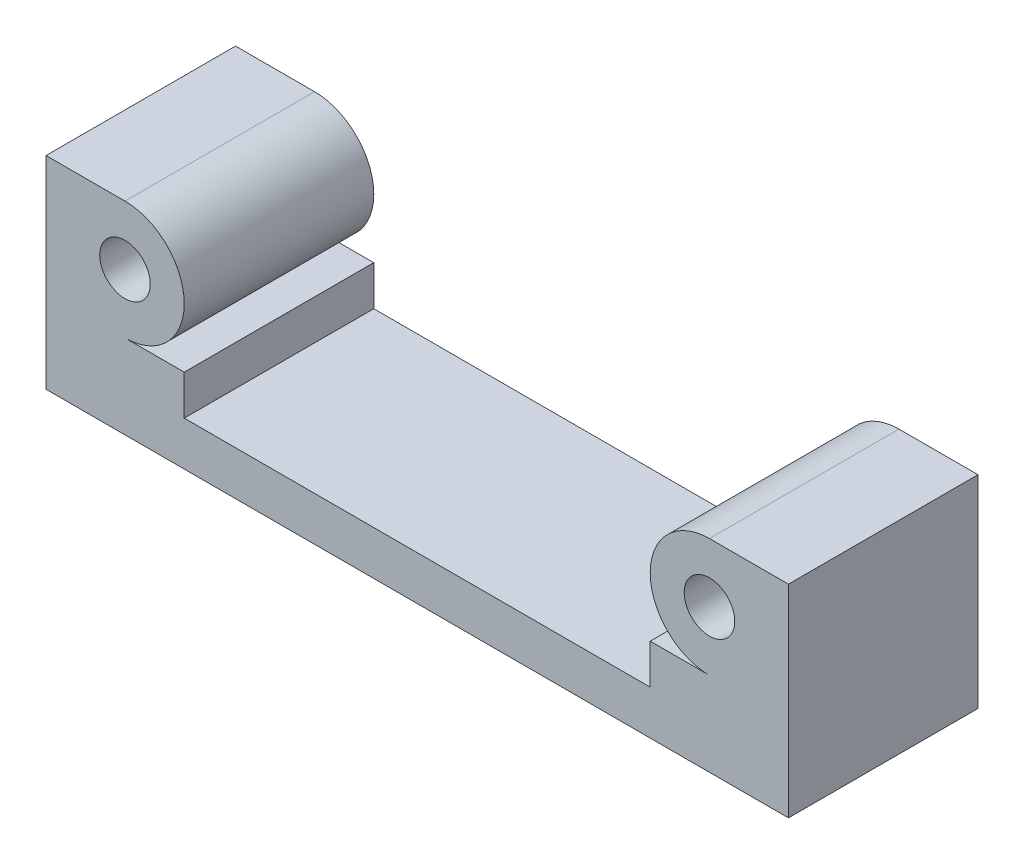
ISO-10303-21;
HEADER;
FILE_DESCRIPTION(('STEP AP214'),'2;1');
FILE_NAME('part.step','',(''),(''),'','','');
FILE_SCHEMA(('AUTOMOTIVE_DESIGN { 1 0 10303 214 1 1 1 1 }'));
ENDSEC;
DATA;
#1=APPLICATION_CONTEXT('core data for automotive mechanical design processes');
#2=APPLICATION_PROTOCOL_DEFINITION('international standard','automotive_design',2000,#1);
#3=PRODUCT_CONTEXT('',#1,'mechanical');
#4=PRODUCT('Part','Part','',(#3));
#5=PRODUCT_RELATED_PRODUCT_CATEGORY('part','',(#4));
#6=PRODUCT_DEFINITION_FORMATION('','',#4);
#7=PRODUCT_DEFINITION_CONTEXT('part definition',#1,'design');
#8=PRODUCT_DEFINITION('design','',#6,#7);
#9=PRODUCT_DEFINITION_SHAPE('','',#8);
#10=(LENGTH_UNIT() NAMED_UNIT(*) SI_UNIT(.MILLI.,.METRE.));
#11=(NAMED_UNIT(*) PLANE_ANGLE_UNIT() SI_UNIT($,.RADIAN.));
#12=(NAMED_UNIT(*) SI_UNIT($,.STERADIAN.) SOLID_ANGLE_UNIT());
#13=UNCERTAINTY_MEASURE_WITH_UNIT(LENGTH_MEASURE(1.E-05),#10,'distance_accuracy_value','');
#14=(GEOMETRIC_REPRESENTATION_CONTEXT(3) GLOBAL_UNCERTAINTY_ASSIGNED_CONTEXT((#13)) GLOBAL_UNIT_ASSIGNED_CONTEXT((#10,
#11,#12)) REPRESENTATION_CONTEXT('',''));
#15=CARTESIAN_POINT('',(0.,0.,0.));
#16=DIRECTION('',(0.,0.,1.));
#17=DIRECTION('',(1.,0.,0.));
#18=AXIS2_PLACEMENT_3D('',#15,#16,#17);
#19=CARTESIAN_POINT('',(0.,2.52312353150435,60.7158822655204));
#20=DIRECTION('',(0.,1.,0.));
#21=DIRECTION('',(0.,0.,1.));
#22=AXIS2_PLACEMENT_3D('',#19,#20,#21);
#23=PLANE('',#22);
#24=DIRECTION('',(0.,0.,-1.));
#25=VECTOR('',#24,1.);
#26=CARTESIAN_POINT('',(-3.75,2.52312353150435,60.7158822655204));
#27=LINE('',#26,#25);
#28=CARTESIAN_POINT('',(-3.75,2.52312353150435,12.));
#29=VERTEX_POINT('',#28);
#30=CARTESIAN_POINT('',(-3.75,2.52312353150435,0.));
#31=VERTEX_POINT('',#30);
#32=EDGE_CURVE('E165',#29,#31,#27,.T.);
#33=ORIENTED_EDGE('',*,*,#32,.F.);
#34=DIRECTION('',(1.,0.,0.));
#35=VECTOR('',#34,1.);
#36=CARTESIAN_POINT('',(0.,2.52312353150435,12.));
#37=LINE('',#36,#35);
#38=CARTESIAN_POINT('',(0.,2.52312353150435,12.));
#39=VERTEX_POINT('',#38);
#40=EDGE_CURVE('E136',#29,#39,#37,.T.);
#41=ORIENTED_EDGE('',*,*,#40,.T.);
#42=DIRECTION('',(0.,0.,-1.));
#43=VECTOR('',#42,1.);
#44=CARTESIAN_POINT('',(0.,2.52312353150435,60.7158822655204));
#45=LINE('',#44,#43);
#46=CARTESIAN_POINT('',(0.,2.52312353150435,0.));
#47=VERTEX_POINT('',#46);
#48=EDGE_CURVE('E162',#39,#47,#45,.T.);
#49=ORIENTED_EDGE('',*,*,#48,.T.);
#50=DIRECTION('',(1.,0.,0.));
#51=VECTOR('',#50,1.);
#52=CARTESIAN_POINT('',(0.,2.52312353150435,0.));
#53=LINE('',#52,#51);
#54=EDGE_CURVE('E170',#31,#47,#53,.T.);
#55=ORIENTED_EDGE('',*,*,#54,.F.);
#56=EDGE_LOOP('',(#33,#41,#49,#55));
#57=FACE_BOUND('',#56,.T.);
#58=ADVANCED_FACE('F37',(#57),#23,.T.);
#59=CARTESIAN_POINT('',(0.,0.,60.7158822655204));
#60=DIRECTION('',(1.,0.,0.));
#61=DIRECTION('',(0.,0.,-1.));
#62=AXIS2_PLACEMENT_3D('',#59,#60,#61);
#63=PLANE('',#62);
#64=ORIENTED_EDGE('',*,*,#48,.F.);
#65=DIRECTION('',(0.,-1.,0.));
#66=VECTOR('',#65,1.);
#67=CARTESIAN_POINT('',(0.,0.,12.));
#68=LINE('',#67,#66);
#69=CARTESIAN_POINT('',(0.,0.,12.));
#70=VERTEX_POINT('',#69);
#71=EDGE_CURVE('E131',#39,#70,#68,.T.);
#72=ORIENTED_EDGE('',*,*,#71,.T.);
#73=DIRECTION('',(0.,0.,-1.));
#74=VECTOR('',#73,1.);
#75=CARTESIAN_POINT('',(0.,0.,60.7158822655204));
#76=LINE('',#75,#74);
#77=CARTESIAN_POINT('',(0.,0.,0.));
#78=VERTEX_POINT('',#77);
#79=EDGE_CURVE('E159',#70,#78,#76,.T.);
#80=ORIENTED_EDGE('',*,*,#79,.T.);
#81=DIRECTION('',(0.,-1.,0.));
#82=VECTOR('',#81,1.);
#83=CARTESIAN_POINT('',(0.,0.,0.));
#84=LINE('',#83,#82);
#85=EDGE_CURVE('E173',#47,#78,#84,.T.);
#86=ORIENTED_EDGE('',*,*,#85,.F.);
#87=EDGE_LOOP('',(#64,#72,#80,#86));
#88=FACE_BOUND('',#87,.T.);
#89=ADVANCED_FACE('F221',(#88),#63,.T.);
#90=CARTESIAN_POINT('',(0.,0.,60.7158822655204));
#91=DIRECTION('',(0.,1.,0.));
#92=DIRECTION('',(0.,0.,1.));
#93=AXIS2_PLACEMENT_3D('',#90,#91,#92);
#94=PLANE('',#93);
#95=ORIENTED_EDGE('',*,*,#79,.F.);
#96=DIRECTION('',(1.,0.,0.));
#97=VECTOR('',#96,1.);
#98=CARTESIAN_POINT('',(0.,0.,12.));
#99=LINE('',#98,#97);
#100=CARTESIAN_POINT('',(29.5,0.,12.));
#101=VERTEX_POINT('',#100);
#102=EDGE_CURVE('E68',#70,#101,#99,.T.);
#103=ORIENTED_EDGE('',*,*,#102,.T.);
#104=DIRECTION('',(0.,0.,-1.));
#105=VECTOR('',#104,1.);
#106=CARTESIAN_POINT('',(29.5,0.,60.7158822655204));
#107=LINE('',#106,#105);
#108=CARTESIAN_POINT('',(29.5,0.,0.));
#109=VERTEX_POINT('',#108);
#110=EDGE_CURVE('E127',#101,#109,#107,.T.);
#111=ORIENTED_EDGE('',*,*,#110,.T.);
#112=DIRECTION('',(1.,0.,0.));
#113=VECTOR('',#112,1.);
#114=CARTESIAN_POINT('',(0.,0.,0.));
#115=LINE('',#114,#113);
#116=EDGE_CURVE('E176',#78,#109,#115,.T.);
#117=ORIENTED_EDGE('',*,*,#116,.F.);
#118=EDGE_LOOP('',(#95,#103,#111,#117));
#119=FACE_BOUND('',#118,.T.);
#120=ADVANCED_FACE('F266',(#119),#94,.T.);
#121=CARTESIAN_POINT('',(29.5,0.,60.7158822655204));
#122=DIRECTION('',(-1.,0.,0.));
#123=DIRECTION('',(0.,0.,1.));
#124=AXIS2_PLACEMENT_3D('',#121,#122,#123);
#125=PLANE('',#124);
#126=ORIENTED_EDGE('',*,*,#110,.F.);
#127=DIRECTION('',(0.,1.,0.));
#128=VECTOR('',#127,1.);
#129=CARTESIAN_POINT('',(29.5,0.,12.));
#130=LINE('',#129,#128);
#131=CARTESIAN_POINT('',(29.5,2.52312353150435,12.));
#132=VERTEX_POINT('',#131);
#133=EDGE_CURVE('E109',#101,#132,#130,.T.);
#134=ORIENTED_EDGE('',*,*,#133,.T.);
#135=DIRECTION('',(0.,0.,-1.));
#136=VECTOR('',#135,1.);
#137=CARTESIAN_POINT('',(29.5,2.52312353150435,60.7158822655204));
#138=LINE('',#137,#136);
#139=CARTESIAN_POINT('',(29.5,2.52312353150435,0.));
#140=VERTEX_POINT('',#139);
#141=EDGE_CURVE('E118',#132,#140,#138,.T.);
#142=ORIENTED_EDGE('',*,*,#141,.T.);
#143=DIRECTION('',(0.,1.,0.));
#144=VECTOR('',#143,1.);
#145=CARTESIAN_POINT('',(29.5,0.,0.));
#146=LINE('',#145,#144);
#147=EDGE_CURVE('E179',#109,#140,#146,.T.);
#148=ORIENTED_EDGE('',*,*,#147,.F.);
#149=EDGE_LOOP('',(#126,#134,#142,#148));
#150=FACE_BOUND('',#149,.T.);
#151=ADVANCED_FACE('F129',(#150),#125,.T.);
#152=CARTESIAN_POINT('',(0.,2.52312353150426,60.7158822655204));
#153=DIRECTION('',(0.,1.,0.));
#154=DIRECTION('',(-1.,0.,0.));
#155=AXIS2_PLACEMENT_3D('',#152,#153,#154);
#156=PLANE('',#155);
#157=ORIENTED_EDGE('',*,*,#141,.F.);
#158=DIRECTION('',(1.,0.,0.));
#159=VECTOR('',#158,1.);
#160=CARTESIAN_POINT('',(0.,2.52312353150426,12.));
#161=LINE('',#160,#159);
#162=CARTESIAN_POINT('',(33.25,2.52312353150437,12.));
#163=VERTEX_POINT('',#162);
#164=EDGE_CURVE('E105',#132,#163,#161,.T.);
#165=ORIENTED_EDGE('',*,*,#164,.T.);
#166=DIRECTION('',(0.,0.,-1.));
#167=VECTOR('',#166,1.);
#168=CARTESIAN_POINT('',(33.25,2.52312353150437,60.7158822655204));
#169=LINE('',#168,#167);
#170=CARTESIAN_POINT('',(33.25,2.52312353150437,0.));
#171=VERTEX_POINT('',#170);
#172=EDGE_CURVE('E126',#163,#171,#169,.T.);
#173=ORIENTED_EDGE('',*,*,#172,.T.);
#174=DIRECTION('',(1.,0.,0.));
#175=VECTOR('',#174,1.);
#176=CARTESIAN_POINT('',(0.,2.52312353150426,0.));
#177=LINE('',#176,#175);
#178=EDGE_CURVE('E122',#140,#171,#177,.T.);
#179=ORIENTED_EDGE('',*,*,#178,.F.);
#180=EDGE_LOOP('',(#157,#165,#173,#179));
#181=FACE_BOUND('',#180,.T.);
#182=ADVANCED_FACE('F119',(#181),#156,.T.);
#183=CARTESIAN_POINT('',(33.25,6.27312353150437,60.7158822655204));
#184=DIRECTION('',(0.,0.,-1.));
#185=DIRECTION('',(-1.,0.,0.));
#186=AXIS2_PLACEMENT_3D('',#183,#184,#185);
#187=CYLINDRICAL_SURFACE('',#186,3.75);
#188=CARTESIAN_POINT('',(33.25,6.27312353150437,12.));
#189=DIRECTION('',(0.,0.,1.));
#190=DIRECTION('',(1.,0.,0.));
#191=AXIS2_PLACEMENT_3D('',#188,#189,#190);
#192=CIRCLE('',#191,3.75);
#193=CARTESIAN_POINT('',(33.25,10.0231235315044,12.));
#194=VERTEX_POINT('',#193);
#195=EDGE_CURVE('E111',#194,#163,#192,.T.);
#196=ORIENTED_EDGE('',*,*,#195,.F.);
#197=DIRECTION('',(0.,0.,-1.));
#198=VECTOR('',#197,1.);
#199=CARTESIAN_POINT('',(33.25,10.0231235315044,60.7158822655204));
#200=LINE('',#199,#198);
#201=CARTESIAN_POINT('',(33.25,10.0231235315044,0.));
#202=VERTEX_POINT('',#201);
#203=EDGE_CURVE('E154',#194,#202,#200,.T.);
#204=ORIENTED_EDGE('',*,*,#203,.T.);
#205=CARTESIAN_POINT('',(33.25,6.27312353150437,0.));
#206=DIRECTION('',(0.,0.,1.));
#207=DIRECTION('',(1.,0.,0.));
#208=AXIS2_PLACEMENT_3D('',#205,#206,#207);
#209=CIRCLE('',#208,3.75);
#210=EDGE_CURVE('E182',#202,#171,#209,.T.);
#211=ORIENTED_EDGE('',*,*,#210,.T.);
#212=ORIENTED_EDGE('',*,*,#172,.F.);
#213=EDGE_LOOP('',(#196,#204,#211,#212));
#214=FACE_BOUND('',#213,.T.);
#215=ADVANCED_FACE('F279',(#214),#187,.T.);
#216=CARTESIAN_POINT('',(0.,10.0231235315044,60.7158822655204));
#217=DIRECTION('',(0.,-1.,0.));
#218=DIRECTION('',(1.,0.,0.));
#219=AXIS2_PLACEMENT_3D('',#216,#217,#218);
#220=PLANE('',#219);
#221=DIRECTION('',(-1.,0.,0.));
#222=VECTOR('',#221,1.);
#223=CARTESIAN_POINT('',(0.,10.0231235315044,12.));
#224=LINE('',#223,#222);
#225=CARTESIAN_POINT('',(38.25,10.0231235315044,12.));
#226=VERTEX_POINT('',#225);
#227=EDGE_CURVE('E207',#226,#194,#224,.T.);
#228=ORIENTED_EDGE('',*,*,#227,.F.);
#229=DIRECTION('',(0.,0.,-1.));
#230=VECTOR('',#229,1.);
#231=CARTESIAN_POINT('',(38.25,10.0231235315044,60.7158822655204));
#232=LINE('',#231,#230);
#233=CARTESIAN_POINT('',(38.25,10.0231235315044,0.));
#234=VERTEX_POINT('',#233);
#235=EDGE_CURVE('E151',#226,#234,#232,.T.);
#236=ORIENTED_EDGE('',*,*,#235,.T.);
#237=DIRECTION('',(-1.,0.,0.));
#238=VECTOR('',#237,1.);
#239=CARTESIAN_POINT('',(0.,10.0231235315044,0.));
#240=LINE('',#239,#238);
#241=EDGE_CURVE('E185',#234,#202,#240,.T.);
#242=ORIENTED_EDGE('',*,*,#241,.T.);
#243=ORIENTED_EDGE('',*,*,#203,.F.);
#244=EDGE_LOOP('',(#228,#236,#242,#243));
#245=FACE_BOUND('',#244,.T.);
#246=ADVANCED_FACE('F282',(#245),#220,.F.);
#247=CARTESIAN_POINT('',(38.25,0.,60.7158822655204));
#248=DIRECTION('',(-1.,0.,0.));
#249=DIRECTION('',(0.,-1.,0.));
#250=AXIS2_PLACEMENT_3D('',#247,#248,#249);
#251=PLANE('',#250);
#252=DIRECTION('',(0.,1.,0.));
#253=VECTOR('',#252,1.);
#254=CARTESIAN_POINT('',(38.25,0.,12.));
#255=LINE('',#254,#253);
#256=CARTESIAN_POINT('',(38.25,-2.79238211236493,12.));
#257=VERTEX_POINT('',#256);
#258=EDGE_CURVE('E56',#257,#226,#255,.T.);
#259=ORIENTED_EDGE('',*,*,#258,.F.);
#260=DIRECTION('',(0.,0.,-1.));
#261=VECTOR('',#260,1.);
#262=CARTESIAN_POINT('',(38.25,-2.79238211236493,60.7158822655204));
#263=LINE('',#262,#261);
#264=CARTESIAN_POINT('',(38.25,-2.79238211236493,0.));
#265=VERTEX_POINT('',#264);
#266=EDGE_CURVE('E148',#257,#265,#263,.T.);
#267=ORIENTED_EDGE('',*,*,#266,.T.);
#268=DIRECTION('',(0.,1.,0.));
#269=VECTOR('',#268,1.);
#270=CARTESIAN_POINT('',(38.25,0.,0.));
#271=LINE('',#270,#269);
#272=EDGE_CURVE('E188',#265,#234,#271,.T.);
#273=ORIENTED_EDGE('',*,*,#272,.T.);
#274=ORIENTED_EDGE('',*,*,#235,.F.);
#275=EDGE_LOOP('',(#259,#267,#273,#274));
#276=FACE_BOUND('',#275,.T.);
#277=ADVANCED_FACE('F286',(#276),#251,.F.);
#278=CARTESIAN_POINT('',(0.,-2.79238211236493,60.7158822655204));
#279=DIRECTION('',(0.,1.,0.));
#280=DIRECTION('',(0.,0.,1.));
#281=AXIS2_PLACEMENT_3D('',#278,#279,#280);
#282=PLANE('',#281);
#283=DIRECTION('',(1.,0.,0.));
#284=VECTOR('',#283,1.);
#285=CARTESIAN_POINT('',(0.,-2.79238211236493,12.));
#286=LINE('',#285,#284);
#287=CARTESIAN_POINT('',(-8.74999999999999,-2.79238211236493,12.));
#288=VERTEX_POINT('',#287);
#289=EDGE_CURVE('E41',#288,#257,#286,.T.);
#290=ORIENTED_EDGE('',*,*,#289,.F.);
#291=DIRECTION('',(0.,0.,-1.));
#292=VECTOR('',#291,1.);
#293=CARTESIAN_POINT('',(-8.75,-2.79238211236493,60.7158822655204));
#294=LINE('',#293,#292);
#295=CARTESIAN_POINT('',(-8.75,-2.79238211236493,0.));
#296=VERTEX_POINT('',#295);
#297=EDGE_CURVE('E145',#288,#296,#294,.T.);
#298=ORIENTED_EDGE('',*,*,#297,.T.);
#299=DIRECTION('',(1.,0.,0.));
#300=VECTOR('',#299,1.);
#301=CARTESIAN_POINT('',(0.,-2.79238211236493,0.));
#302=LINE('',#301,#300);
#303=EDGE_CURVE('E191',#296,#265,#302,.T.);
#304=ORIENTED_EDGE('',*,*,#303,.T.);
#305=ORIENTED_EDGE('',*,*,#266,.F.);
#306=EDGE_LOOP('',(#290,#298,#304,#305));
#307=FACE_BOUND('',#306,.T.);
#308=ADVANCED_FACE('F290',(#307),#282,.F.);
#309=CARTESIAN_POINT('',(-8.75,0.,60.7158822655204));
#310=DIRECTION('',(1.,0.,0.));
#311=DIRECTION('',(0.,1.,0.));
#312=AXIS2_PLACEMENT_3D('',#309,#310,#311);
#313=PLANE('',#312);
#314=DIRECTION('',(0.,-1.,0.));
#315=VECTOR('',#314,1.);
#316=CARTESIAN_POINT('',(-8.75,0.,12.));
#317=LINE('',#316,#315);
#318=CARTESIAN_POINT('',(-8.75,10.0231235315044,12.));
#319=VERTEX_POINT('',#318);
#320=EDGE_CURVE('E92',#319,#288,#317,.T.);
#321=ORIENTED_EDGE('',*,*,#320,.F.);
#322=DIRECTION('',(0.,0.,-1.));
#323=VECTOR('',#322,1.);
#324=CARTESIAN_POINT('',(-8.75,10.0231235315044,60.7158822655204));
#325=LINE('',#324,#323);
#326=CARTESIAN_POINT('',(-8.75,10.0231235315044,0.));
#327=VERTEX_POINT('',#326);
#328=EDGE_CURVE('E142',#319,#327,#325,.T.);
#329=ORIENTED_EDGE('',*,*,#328,.T.);
#330=DIRECTION('',(0.,-1.,0.));
#331=VECTOR('',#330,1.);
#332=CARTESIAN_POINT('',(-8.75,0.,0.));
#333=LINE('',#332,#331);
#334=EDGE_CURVE('E194',#327,#296,#333,.T.);
#335=ORIENTED_EDGE('',*,*,#334,.T.);
#336=ORIENTED_EDGE('',*,*,#297,.F.);
#337=EDGE_LOOP('',(#321,#329,#335,#336));
#338=FACE_BOUND('',#337,.T.);
#339=ADVANCED_FACE('F259',(#338),#313,.F.);
#340=CARTESIAN_POINT('',(0.,10.0231235315044,60.7158822655204));
#341=DIRECTION('',(0.,-1.,0.));
#342=DIRECTION('',(0.,0.,-1.));
#343=AXIS2_PLACEMENT_3D('',#340,#341,#342);
#344=PLANE('',#343);
#345=DIRECTION('',(-1.,0.,0.));
#346=VECTOR('',#345,1.);
#347=CARTESIAN_POINT('',(0.,10.0231235315044,12.));
#348=LINE('',#347,#346);
#349=CARTESIAN_POINT('',(-3.75,10.0231235315044,12.));
#350=VERTEX_POINT('',#349);
#351=EDGE_CURVE('E88',#350,#319,#348,.T.);
#352=ORIENTED_EDGE('',*,*,#351,.F.);
#353=DIRECTION('',(0.,0.,-1.));
#354=VECTOR('',#353,1.);
#355=CARTESIAN_POINT('',(-3.75,10.0231235315044,60.7158822655204));
#356=LINE('',#355,#354);
#357=CARTESIAN_POINT('',(-3.75,10.0231235315044,0.));
#358=VERTEX_POINT('',#357);
#359=EDGE_CURVE('E139',#350,#358,#356,.T.);
#360=ORIENTED_EDGE('',*,*,#359,.T.);
#361=DIRECTION('',(-1.,0.,0.));
#362=VECTOR('',#361,1.);
#363=CARTESIAN_POINT('',(0.,10.0231235315044,0.));
#364=LINE('',#363,#362);
#365=EDGE_CURVE('E197',#358,#327,#364,.T.);
#366=ORIENTED_EDGE('',*,*,#365,.T.);
#367=ORIENTED_EDGE('',*,*,#328,.F.);
#368=EDGE_LOOP('',(#352,#360,#366,#367));
#369=FACE_BOUND('',#368,.T.);
#370=ADVANCED_FACE('F249',(#369),#344,.F.);
#371=CARTESIAN_POINT('',(-3.75,6.27312353150435,60.7158822655204));
#372=DIRECTION('',(0.,0.,-1.));
#373=DIRECTION('',(-1.,0.,0.));
#374=AXIS2_PLACEMENT_3D('',#371,#372,#373);
#375=CYLINDRICAL_SURFACE('',#374,3.75);
#376=CARTESIAN_POINT('',(-3.75,6.27312353150435,12.));
#377=DIRECTION('',(0.,0.,1.));
#378=DIRECTION('',(1.,0.,0.));
#379=AXIS2_PLACEMENT_3D('',#376,#377,#378);
#380=CIRCLE('',#379,3.75);
#381=EDGE_CURVE('E78',#29,#350,#380,.T.);
#382=ORIENTED_EDGE('',*,*,#381,.F.);
#383=ORIENTED_EDGE('',*,*,#32,.T.);
#384=CARTESIAN_POINT('',(-3.75,6.27312353150435,0.));
#385=DIRECTION('',(0.,0.,1.));
#386=DIRECTION('',(1.,0.,0.));
#387=AXIS2_PLACEMENT_3D('',#384,#385,#386);
#388=CIRCLE('',#387,3.75);
#389=EDGE_CURVE('E200',#31,#358,#388,.T.);
#390=ORIENTED_EDGE('',*,*,#389,.T.);
#391=ORIENTED_EDGE('',*,*,#359,.F.);
#392=EDGE_LOOP('',(#382,#383,#390,#391));
#393=FACE_BOUND('',#392,.T.);
#394=ADVANCED_FACE('F252',(#393),#375,.T.);
#395=CARTESIAN_POINT('',(-3.75,6.27312353150435,60.7158822655204));
#396=DIRECTION('',(0.,0.,-1.));
#397=DIRECTION('',(-1.,0.,0.));
#398=AXIS2_PLACEMENT_3D('',#395,#396,#397);
#399=CYLINDRICAL_SURFACE('',#398,1.6);
#400=CARTESIAN_POINT('',(-3.75,6.27312353150435,0.));
#401=DIRECTION('',(0.,0.,1.));
#402=DIRECTION('',(1.,0.,0.));
#403=AXIS2_PLACEMENT_3D('',#400,#401,#402);
#404=CIRCLE('',#403,1.6);
#405=CARTESIAN_POINT('',(-5.35,6.27312353150435,0.));
#406=VERTEX_POINT('',#405);
#407=EDGE_CURVE('E203',#406,#406,#404,.T.);
#408=CARTESIAN_POINT('',(-3.75,6.27312353150435,12.));
#409=DIRECTION('',(0.,0.,1.));
#410=DIRECTION('',(1.,0.,0.));
#411=AXIS2_PLACEMENT_3D('',#408,#409,#410);
#412=CIRCLE('',#411,1.6);
#413=CARTESIAN_POINT('',(-5.35,6.27312353150435,12.));
#414=VERTEX_POINT('',#413);
#415=EDGE_CURVE('E11',#414,#414,#412,.T.);
#416=CARTESIAN_POINT('',(-5.35,6.27312353150435,0.));
#417=CARTESIAN_POINT('',(-5.35,6.27312353150435,0.125));
#418=CARTESIAN_POINT('',(-5.35,6.27312353150435,0.25));
#419=CARTESIAN_POINT('',(-5.35,6.27312353150435,0.5));
#420=CARTESIAN_POINT('',(-5.35,6.27312353150435,0.625000000000001));
#421=CARTESIAN_POINT('',(-5.35,6.27312353150435,0.875000000000001));
#422=CARTESIAN_POINT('',(-5.35,6.27312353150435,1.));
#423=CARTESIAN_POINT('',(-5.35,6.27312353150435,1.25));
#424=CARTESIAN_POINT('',(-5.35,6.27312353150435,1.375));
#425=CARTESIAN_POINT('',(-5.35,6.27312353150435,1.625));
#426=CARTESIAN_POINT('',(-5.35,6.27312353150435,1.75));
#427=CARTESIAN_POINT('',(-5.35,6.27312353150435,1.99999999999999));
#428=CARTESIAN_POINT('',(-5.35,6.27312353150435,2.125));
#429=CARTESIAN_POINT('',(-5.35,6.27312353150435,2.375));
#430=CARTESIAN_POINT('',(-5.35,6.27312353150435,2.5));
#431=CARTESIAN_POINT('',(-5.35,6.27312353150435,2.75));
#432=CARTESIAN_POINT('',(-5.35,6.27312353150435,2.875));
#433=CARTESIAN_POINT('',(-5.35,6.27312353150435,3.125));
#434=CARTESIAN_POINT('',(-5.35,6.27312353150435,3.25));
#435=CARTESIAN_POINT('',(-5.35,6.27312353150435,3.5));
#436=CARTESIAN_POINT('',(-5.35,6.27312353150435,3.625));
#437=CARTESIAN_POINT('',(-5.35,6.27312353150435,3.875));
#438=CARTESIAN_POINT('',(-5.35,6.27312353150435,4.));
#439=CARTESIAN_POINT('',(-5.35,6.27312353150435,4.24999999999999));
#440=CARTESIAN_POINT('',(-5.35,6.27312353150435,4.37499999999999));
#441=CARTESIAN_POINT('',(-5.35,6.27312353150435,4.62499999999999));
#442=CARTESIAN_POINT('',(-5.35,6.27312353150435,4.74999999999999));
#443=CARTESIAN_POINT('',(-5.35,6.27312353150435,4.99999999999999));
#444=CARTESIAN_POINT('',(-5.35,6.27312353150435,5.12499999999999));
#445=CARTESIAN_POINT('',(-5.35,6.27312353150435,5.37499999999999));
#446=CARTESIAN_POINT('',(-5.35,6.27312353150435,5.49999999999999));
#447=CARTESIAN_POINT('',(-5.35,6.27312353150435,5.74999999999999));
#448=CARTESIAN_POINT('',(-5.35,6.27312353150435,5.87499999999999));
#449=CARTESIAN_POINT('',(-5.35,6.27312353150435,6.12499999999999));
#450=CARTESIAN_POINT('',(-5.35,6.27312353150435,6.24999999999999));
#451=CARTESIAN_POINT('',(-5.35,6.27312353150435,6.49999999999999));
#452=CARTESIAN_POINT('',(-5.35,6.27312353150435,6.62499999999999));
#453=CARTESIAN_POINT('',(-5.35,6.27312353150435,6.87499999999999));
#454=CARTESIAN_POINT('',(-5.35,6.27312353150435,6.99999999999999));
#455=CARTESIAN_POINT('',(-5.35,6.27312353150435,7.24999999999999));
#456=CARTESIAN_POINT('',(-5.35,6.27312353150435,7.37499999999999));
#457=CARTESIAN_POINT('',(-5.35,6.27312353150435,7.62499999999999));
#458=CARTESIAN_POINT('',(-5.35,6.27312353150435,7.74999999999999));
#459=CARTESIAN_POINT('',(-5.35,6.27312353150435,7.99999999999999));
#460=CARTESIAN_POINT('',(-5.35,6.27312353150435,8.12499999999999));
#461=CARTESIAN_POINT('',(-5.35,6.27312353150435,8.37499999999999));
#462=CARTESIAN_POINT('',(-5.35,6.27312353150435,8.49999999999999));
#463=CARTESIAN_POINT('',(-5.35,6.27312353150435,8.74999999999999));
#464=CARTESIAN_POINT('',(-5.35,6.27312353150435,8.87499999999999));
#465=CARTESIAN_POINT('',(-5.35,6.27312353150435,9.12499999999999));
#466=CARTESIAN_POINT('',(-5.35,6.27312353150435,9.24999999999999));
#467=CARTESIAN_POINT('',(-5.35,6.27312353150435,9.49999999999999));
#468=CARTESIAN_POINT('',(-5.35,6.27312353150435,9.62499999999999));
#469=CARTESIAN_POINT('',(-5.35,6.27312353150435,9.87499999999999));
#470=CARTESIAN_POINT('',(-5.35,6.27312353150435,9.99999999999998));
#471=CARTESIAN_POINT('',(-5.35,6.27312353150435,10.25));
#472=CARTESIAN_POINT('',(-5.35,6.27312353150435,10.375));
#473=CARTESIAN_POINT('',(-5.35,6.27312353150435,10.625));
#474=CARTESIAN_POINT('',(-5.35,6.27312353150435,10.75));
#475=CARTESIAN_POINT('',(-5.35,6.27312353150435,11.));
#476=CARTESIAN_POINT('',(-5.35,6.27312353150435,11.125));
#477=CARTESIAN_POINT('',(-5.35,6.27312353150435,11.375));
#478=CARTESIAN_POINT('',(-5.35,6.27312353150435,11.5));
#479=CARTESIAN_POINT('',(-5.35,6.27312353150435,11.75));
#480=CARTESIAN_POINT('',(-5.35,6.27312353150435,11.875));
#481=CARTESIAN_POINT('',(-5.35,6.27312353150435,12.));
#482=B_SPLINE_CURVE_WITH_KNOTS('',3,(#416,#417,#418,#419,#420,#421,#422,#423,#424,#425,#426,
#427,#428,#429,#430,#431,#432,#433,#434,#435,#436,#437,#438,#439,#440,#441,#442,#443,#444,#445,
#446,#447,#448,#449,#450,#451,#452,#453,#454,#455,#456,#457,#458,#459,#460,#461,#462,#463,#464,
#465,#466,#467,#468,#469,#470,#471,#472,#473,#474,#475,#476,#477,#478,#479,#480,#481),
.UNSPECIFIED.,.F.,.F.,(4,2,2,2,2,2,2,2,2,2,2,2,2,2,2,2,2,2,2,2,2,2,2,2,2,2,2,2,2,2,2,2,4),(0.,
0.375,0.750000000000001,1.125,1.5,1.87499999999999,2.25,2.625,3.,3.375,3.75,4.125,
4.49999999999999,4.87499999999999,5.24999999999999,5.62499999999999,5.99999999999999,
6.37499999999999,6.74999999999999,7.12499999999999,7.49999999999999,7.87499999999999,
8.24999999999999,8.62499999999999,8.99999999999999,9.37499999999999,9.74999999999999,10.125,
10.5,10.875,11.25,11.625,12.),.UNSPECIFIED.);
#483=EDGE_CURVE('BSEAM39',#406,#414,#482,.T.);
#484=ORIENTED_EDGE('',*,*,#407,.F.);
#485=ORIENTED_EDGE('',*,*,#415,.T.);
#486=ORIENTED_EDGE('',*,*,#483,.T.);
#487=ORIENTED_EDGE('',*,*,#483,.F.);
#488=EDGE_LOOP('',(#484,#486,#485,#487));
#489=FACE_BOUND('',#488,.T.);
#490=ADVANCED_FACE('F39',(#489),#399,.F.);
#491=CARTESIAN_POINT('',(0.,0.,0.));
#492=DIRECTION('',(0.,0.,1.));
#493=DIRECTION('',(1.,0.,0.));
#494=AXIS2_PLACEMENT_3D('',#491,#492,#493);
#495=PLANE('',#494);
#496=ORIENTED_EDGE('',*,*,#407,.T.);
#497=EDGE_LOOP('',(#496));
#498=FACE_BOUND('',#497,.T.);
#499=ORIENTED_EDGE('',*,*,#389,.F.);
#500=ORIENTED_EDGE('',*,*,#54,.T.);
#501=ORIENTED_EDGE('',*,*,#85,.T.);
#502=ORIENTED_EDGE('',*,*,#116,.T.);
#503=ORIENTED_EDGE('',*,*,#147,.T.);
#504=ORIENTED_EDGE('',*,*,#178,.T.);
#505=ORIENTED_EDGE('',*,*,#210,.F.);
#506=ORIENTED_EDGE('',*,*,#241,.F.);
#507=ORIENTED_EDGE('',*,*,#272,.F.);
#508=ORIENTED_EDGE('',*,*,#303,.F.);
#509=ORIENTED_EDGE('',*,*,#334,.F.);
#510=ORIENTED_EDGE('',*,*,#365,.F.);
#511=EDGE_LOOP('',(#499,#500,#501,#502,#503,#504,#505,#506,#507,#508,#509,#510));
#512=FACE_BOUND('',#511,.T.);
#513=CARTESIAN_POINT('',(33.25,6.27312353150437,0.));
#514=DIRECTION('',(0.,0.,1.));
#515=DIRECTION('',(1.,0.,0.));
#516=AXIS2_PLACEMENT_3D('',#513,#514,#515);
#517=CIRCLE('',#516,1.6);
#518=CARTESIAN_POINT('',(31.65,6.27312353150437,0.));
#519=VERTEX_POINT('',#518);
#520=EDGE_CURVE('E167',#519,#519,#517,.T.);
#521=ORIENTED_EDGE('',*,*,#520,.T.);
#522=EDGE_LOOP('',(#521));
#523=FACE_BOUND('',#522,.T.);
#524=ADVANCED_FACE('F227',(#498,#512,#523),#495,.F.);
#525=CARTESIAN_POINT('',(33.25,6.27312353150437,60.7158822655204));
#526=DIRECTION('',(0.,0.,-1.));
#527=DIRECTION('',(-1.,0.,0.));
#528=AXIS2_PLACEMENT_3D('',#525,#526,#527);
#529=CYLINDRICAL_SURFACE('',#528,1.6);
#530=CARTESIAN_POINT('',(33.25,6.27312353150437,12.));
#531=DIRECTION('',(0.,0.,1.));
#532=DIRECTION('',(1.,0.,0.));
#533=AXIS2_PLACEMENT_3D('',#530,#531,#532);
#534=CIRCLE('',#533,1.6);
#535=CARTESIAN_POINT('',(31.65,6.27312353150437,12.));
#536=VERTEX_POINT('',#535);
#537=EDGE_CURVE('E47',#536,#536,#534,.T.);
#538=CARTESIAN_POINT('',(31.65,6.27312353150437,0.));
#539=CARTESIAN_POINT('',(31.65,6.27312353150437,0.125));
#540=CARTESIAN_POINT('',(31.65,6.27312353150437,0.25));
#541=CARTESIAN_POINT('',(31.65,6.27312353150437,0.5));
#542=CARTESIAN_POINT('',(31.65,6.27312353150437,0.625000000000001));
#543=CARTESIAN_POINT('',(31.65,6.27312353150437,0.875000000000001));
#544=CARTESIAN_POINT('',(31.65,6.27312353150437,1.));
#545=CARTESIAN_POINT('',(31.65,6.27312353150437,1.25));
#546=CARTESIAN_POINT('',(31.65,6.27312353150437,1.375));
#547=CARTESIAN_POINT('',(31.65,6.27312353150437,1.625));
#548=CARTESIAN_POINT('',(31.65,6.27312353150437,1.75));
#549=CARTESIAN_POINT('',(31.65,6.27312353150437,1.99999999999999));
#550=CARTESIAN_POINT('',(31.65,6.27312353150437,2.125));
#551=CARTESIAN_POINT('',(31.65,6.27312353150437,2.375));
#552=CARTESIAN_POINT('',(31.65,6.27312353150437,2.5));
#553=CARTESIAN_POINT('',(31.65,6.27312353150437,2.75));
#554=CARTESIAN_POINT('',(31.65,6.27312353150437,2.875));
#555=CARTESIAN_POINT('',(31.65,6.27312353150437,3.125));
#556=CARTESIAN_POINT('',(31.65,6.27312353150437,3.25));
#557=CARTESIAN_POINT('',(31.65,6.27312353150437,3.5));
#558=CARTESIAN_POINT('',(31.65,6.27312353150437,3.625));
#559=CARTESIAN_POINT('',(31.65,6.27312353150437,3.875));
#560=CARTESIAN_POINT('',(31.65,6.27312353150437,4.));
#561=CARTESIAN_POINT('',(31.65,6.27312353150437,4.24999999999999));
#562=CARTESIAN_POINT('',(31.65,6.27312353150437,4.37499999999999));
#563=CARTESIAN_POINT('',(31.65,6.27312353150437,4.62499999999999));
#564=CARTESIAN_POINT('',(31.65,6.27312353150437,4.74999999999999));
#565=CARTESIAN_POINT('',(31.65,6.27312353150437,4.99999999999999));
#566=CARTESIAN_POINT('',(31.65,6.27312353150437,5.12499999999999));
#567=CARTESIAN_POINT('',(31.65,6.27312353150437,5.37499999999999));
#568=CARTESIAN_POINT('',(31.65,6.27312353150437,5.49999999999999));
#569=CARTESIAN_POINT('',(31.65,6.27312353150437,5.74999999999999));
#570=CARTESIAN_POINT('',(31.65,6.27312353150437,5.87499999999999));
#571=CARTESIAN_POINT('',(31.65,6.27312353150437,6.12499999999999));
#572=CARTESIAN_POINT('',(31.65,6.27312353150437,6.24999999999999));
#573=CARTESIAN_POINT('',(31.65,6.27312353150437,6.49999999999999));
#574=CARTESIAN_POINT('',(31.65,6.27312353150437,6.62499999999999));
#575=CARTESIAN_POINT('',(31.65,6.27312353150437,6.87499999999999));
#576=CARTESIAN_POINT('',(31.65,6.27312353150437,6.99999999999999));
#577=CARTESIAN_POINT('',(31.65,6.27312353150437,7.24999999999999));
#578=CARTESIAN_POINT('',(31.65,6.27312353150437,7.37499999999999));
#579=CARTESIAN_POINT('',(31.65,6.27312353150437,7.62499999999999));
#580=CARTESIAN_POINT('',(31.65,6.27312353150437,7.74999999999999));
#581=CARTESIAN_POINT('',(31.65,6.27312353150437,7.99999999999999));
#582=CARTESIAN_POINT('',(31.65,6.27312353150437,8.12499999999999));
#583=CARTESIAN_POINT('',(31.65,6.27312353150437,8.37499999999999));
#584=CARTESIAN_POINT('',(31.65,6.27312353150437,8.49999999999999));
#585=CARTESIAN_POINT('',(31.65,6.27312353150437,8.74999999999999));
#586=CARTESIAN_POINT('',(31.65,6.27312353150437,8.87499999999999));
#587=CARTESIAN_POINT('',(31.65,6.27312353150437,9.12499999999999));
#588=CARTESIAN_POINT('',(31.65,6.27312353150437,9.24999999999999));
#589=CARTESIAN_POINT('',(31.65,6.27312353150437,9.49999999999999));
#590=CARTESIAN_POINT('',(31.65,6.27312353150437,9.62499999999999));
#591=CARTESIAN_POINT('',(31.65,6.27312353150437,9.87499999999999));
#592=CARTESIAN_POINT('',(31.65,6.27312353150437,9.99999999999998));
#593=CARTESIAN_POINT('',(31.65,6.27312353150437,10.25));
#594=CARTESIAN_POINT('',(31.65,6.27312353150437,10.375));
#595=CARTESIAN_POINT('',(31.65,6.27312353150437,10.625));
#596=CARTESIAN_POINT('',(31.65,6.27312353150437,10.75));
#597=CARTESIAN_POINT('',(31.65,6.27312353150437,11.));
#598=CARTESIAN_POINT('',(31.65,6.27312353150437,11.125));
#599=CARTESIAN_POINT('',(31.65,6.27312353150437,11.375));
#600=CARTESIAN_POINT('',(31.65,6.27312353150437,11.5));
#601=CARTESIAN_POINT('',(31.65,6.27312353150437,11.75));
#602=CARTESIAN_POINT('',(31.65,6.27312353150437,11.875));
#603=CARTESIAN_POINT('',(31.65,6.27312353150437,12.));
#604=B_SPLINE_CURVE_WITH_KNOTS('',3,(#538,#539,#540,#541,#542,#543,#544,#545,#546,#547,#548,
#549,#550,#551,#552,#553,#554,#555,#556,#557,#558,#559,#560,#561,#562,#563,#564,#565,#566,#567,
#568,#569,#570,#571,#572,#573,#574,#575,#576,#577,#578,#579,#580,#581,#582,#583,#584,#585,#586,
#587,#588,#589,#590,#591,#592,#593,#594,#595,#596,#597,#598,#599,#600,#601,#602,#603),
.UNSPECIFIED.,.F.,.F.,(4,2,2,2,2,2,2,2,2,2,2,2,2,2,2,2,2,2,2,2,2,2,2,2,2,2,2,2,2,2,2,2,4),(0.,
0.375,0.750000000000001,1.125,1.5,1.87499999999999,2.25,2.625,3.,3.375,3.75,4.125,
4.49999999999999,4.87499999999999,5.24999999999999,5.62499999999999,5.99999999999999,
6.37499999999999,6.74999999999999,7.12499999999999,7.49999999999999,7.87499999999999,
8.24999999999999,8.62499999999999,8.99999999999999,9.37499999999999,9.74999999999999,10.125,
10.5,10.875,11.25,11.625,12.),.UNSPECIFIED.);
#605=EDGE_CURVE('BSEAM269',#519,#536,#604,.T.);
#606=ORIENTED_EDGE('',*,*,#520,.F.);
#607=ORIENTED_EDGE('',*,*,#537,.T.);
#608=ORIENTED_EDGE('',*,*,#605,.T.);
#609=ORIENTED_EDGE('',*,*,#605,.F.);
#610=EDGE_LOOP('',(#606,#608,#607,#609));
#611=FACE_BOUND('',#610,.T.);
#612=ADVANCED_FACE('F269',(#611),#529,.F.);
#613=CARTESIAN_POINT('',(-22.0500000000044,85.4999999999981,12.));
#614=DIRECTION('',(0.,0.,1.));
#615=DIRECTION('',(1.,0.,0.));
#616=AXIS2_PLACEMENT_3D('',#613,#614,#615);
#617=PLANE('',#616);
#618=ORIENTED_EDGE('',*,*,#537,.F.);
#619=EDGE_LOOP('',(#618));
#620=FACE_BOUND('',#619,.T.);
#621=ORIENTED_EDGE('',*,*,#415,.F.);
#622=EDGE_LOOP('',(#621));
#623=FACE_BOUND('',#622,.T.);
#624=ORIENTED_EDGE('',*,*,#258,.T.);
#625=ORIENTED_EDGE('',*,*,#227,.T.);
#626=ORIENTED_EDGE('',*,*,#195,.T.);
#627=ORIENTED_EDGE('',*,*,#164,.F.);
#628=ORIENTED_EDGE('',*,*,#133,.F.);
#629=ORIENTED_EDGE('',*,*,#102,.F.);
#630=ORIENTED_EDGE('',*,*,#71,.F.);
#631=ORIENTED_EDGE('',*,*,#40,.F.);
#632=ORIENTED_EDGE('',*,*,#381,.T.);
#633=ORIENTED_EDGE('',*,*,#351,.T.);
#634=ORIENTED_EDGE('',*,*,#320,.T.);
#635=ORIENTED_EDGE('',*,*,#289,.T.);
#636=EDGE_LOOP('',(#624,#625,#626,#627,#628,#629,#630,#631,#632,#633,#634,#635));
#637=FACE_BOUND('',#636,.T.);
#638=ADVANCED_FACE('F107',(#620,#623,#637),#617,.T.);
#639=CLOSED_SHELL('',(#58,#89,#120,#151,#182,#215,#246,#277,#308,#339,#370,#394,#490,#524,#612,#638));
#640=MANIFOLD_SOLID_BREP('B2',#639);
#641=ADVANCED_BREP_SHAPE_REPRESENTATION('',(#18,#640),#14);
#642=SHAPE_DEFINITION_REPRESENTATION(#9,#641);
ENDSEC;
END-ISO-10303-21;
